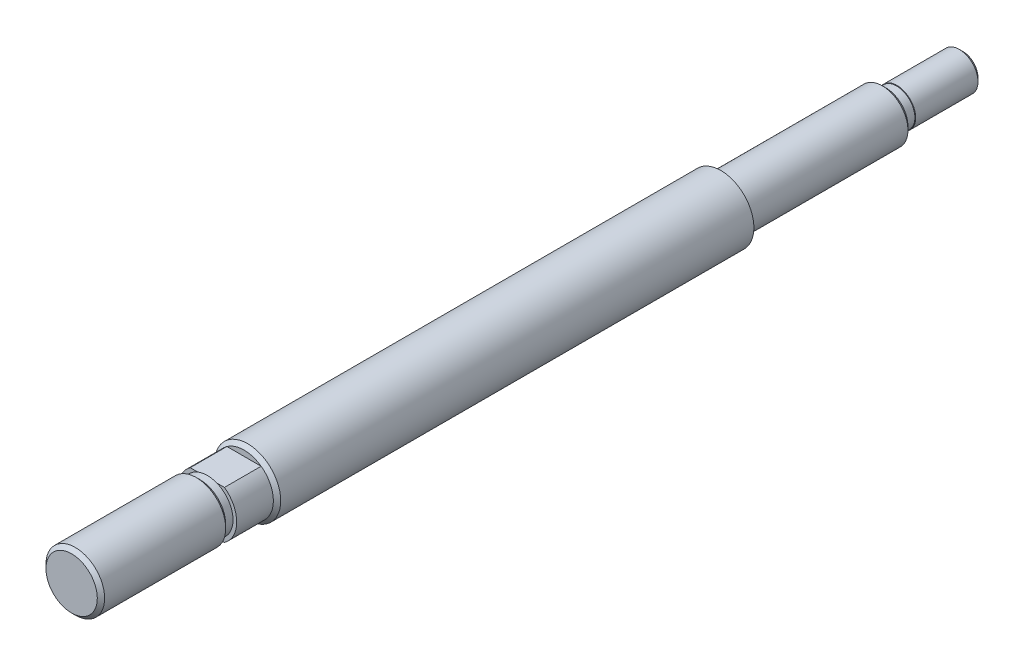
ISO-10303-21;
HEADER;
FILE_DESCRIPTION(('STEP AP214'),'2;1');
FILE_NAME('part.step','',(''),(''),'','','');
FILE_SCHEMA(('AUTOMOTIVE_DESIGN { 1 0 10303 214 1 1 1 1 }'));
ENDSEC;
DATA;
#1=APPLICATION_CONTEXT('core data for automotive mechanical design processes');
#2=APPLICATION_PROTOCOL_DEFINITION('international standard','automotive_design',2000,#1);
#3=PRODUCT_CONTEXT('',#1,'mechanical');
#4=PRODUCT('Part','Part','',(#3));
#5=PRODUCT_RELATED_PRODUCT_CATEGORY('part','',(#4));
#6=PRODUCT_DEFINITION_FORMATION('','',#4);
#7=PRODUCT_DEFINITION_CONTEXT('part definition',#1,'design');
#8=PRODUCT_DEFINITION('design','',#6,#7);
#9=PRODUCT_DEFINITION_SHAPE('','',#8);
#10=(LENGTH_UNIT() NAMED_UNIT(*) SI_UNIT(.MILLI.,.METRE.));
#11=(NAMED_UNIT(*) PLANE_ANGLE_UNIT() SI_UNIT($,.RADIAN.));
#12=(NAMED_UNIT(*) SI_UNIT($,.STERADIAN.) SOLID_ANGLE_UNIT());
#13=UNCERTAINTY_MEASURE_WITH_UNIT(LENGTH_MEASURE(1.E-05),#10,'distance_accuracy_value','');
#14=(GEOMETRIC_REPRESENTATION_CONTEXT(3) GLOBAL_UNCERTAINTY_ASSIGNED_CONTEXT((#13)) GLOBAL_UNIT_ASSIGNED_CONTEXT((#10,
#11,#12)) REPRESENTATION_CONTEXT('',''));
#15=CARTESIAN_POINT('',(0.,0.,0.));
#16=DIRECTION('',(0.,0.,1.));
#17=DIRECTION('',(1.,0.,0.));
#18=AXIS2_PLACEMENT_3D('',#15,#16,#17);
#19=CARTESIAN_POINT('',(0.,0.,84.5));
#20=DIRECTION('',(0.,0.,1.));
#21=DIRECTION('',(1.,0.,0.));
#22=AXIS2_PLACEMENT_3D('',#19,#20,#21);
#23=PLANE('',#22);
#24=DIRECTION('',(1.,0.,0.));
#25=VECTOR('',#24,1.);
#26=CARTESIAN_POINT('',(-17.5,-6.5,84.5));
#27=LINE('',#26,#25);
#28=CARTESIAN_POINT('',(2.59807621135341,-6.5,84.4999999999914));
#29=VERTEX_POINT('',#28);
#30=CARTESIAN_POINT('',(4.66368952654441,-6.5,84.5));
#31=VERTEX_POINT('',#30);
#32=EDGE_CURVE('E113',#29,#31,#27,.T.);
#33=ORIENTED_EDGE('',*,*,#32,.T.);
#34=CARTESIAN_POINT('',(0.,0.,84.5));
#35=DIRECTION('',(0.,0.,1.));
#36=DIRECTION('',(1.,0.,0.));
#37=AXIS2_PLACEMENT_3D('',#34,#35,#36);
#38=CIRCLE('',#37,8.);
#39=CARTESIAN_POINT('',(4.66368952654441,6.5,84.5));
#40=VERTEX_POINT('',#39);
#41=EDGE_CURVE('E126',#31,#40,#38,.T.);
#42=ORIENTED_EDGE('',*,*,#41,.T.);
#43=DIRECTION('',(1.,0.,0.));
#44=VECTOR('',#43,1.);
#45=CARTESIAN_POINT('',(-17.5,6.5,84.5));
#46=LINE('',#45,#44);
#47=CARTESIAN_POINT('',(2.59807621135341,6.5,84.4999999999914));
#48=VERTEX_POINT('',#47);
#49=EDGE_CURVE('E267',#48,#40,#46,.T.);
#50=ORIENTED_EDGE('',*,*,#49,.F.);
#51=CARTESIAN_POINT('',(0.,0.,84.4999999999914));
#52=DIRECTION('',(0.,0.,1.));
#53=DIRECTION('',(1.,0.,0.));
#54=AXIS2_PLACEMENT_3D('',#51,#52,#53);
#55=CIRCLE('',#54,7.00000000000003);
#56=EDGE_CURVE('E263',#29,#48,#55,.T.);
#57=ORIENTED_EDGE('',*,*,#56,.F.);
#58=EDGE_LOOP('',(#33,#42,#50,#57));
#59=FACE_BOUND('',#58,.T.);
#60=ADVANCED_FACE('F49',(#59),#23,.T.);
#61=CARTESIAN_POINT('',(0.,0.,84.5));
#62=DIRECTION('',(0.,0.,-1.));
#63=DIRECTION('',(-1.,0.,0.));
#64=AXIS2_PLACEMENT_3D('',#61,#62,#63);
#65=CYLINDRICAL_SURFACE('',#64,8.);
#66=CARTESIAN_POINT('',(0.,0.,74.5));
#67=DIRECTION('',(0.,0.,1.));
#68=DIRECTION('',(1.,0.,0.));
#69=AXIS2_PLACEMENT_3D('',#66,#67,#68);
#70=CIRCLE('',#69,8.);
#71=CARTESIAN_POINT('',(-4.66368952654447,6.5,74.5));
#72=VERTEX_POINT('',#71);
#73=CARTESIAN_POINT('',(-4.66368952654447,-6.5,74.5));
#74=VERTEX_POINT('',#73);
#75=EDGE_CURVE('E121',#72,#74,#70,.T.);
#76=ORIENTED_EDGE('',*,*,#75,.T.);
#77=DIRECTION('',(0.,0.,-1.));
#78=VECTOR('',#77,1.);
#79=CARTESIAN_POINT('',(-4.66368952654441,-6.5,84.5));
#80=LINE('',#79,#78);
#81=CARTESIAN_POINT('',(-4.66368952654441,-6.5,84.5));
#82=VERTEX_POINT('',#81);
#83=EDGE_CURVE('E106',#74,#82,#80,.F.);
#84=ORIENTED_EDGE('',*,*,#83,.T.);
#85=CARTESIAN_POINT('',(-4.66368952654441,6.5,84.5));
#86=VERTEX_POINT('',#85);
#87=EDGE_CURVE('E119',#86,#82,#38,.T.);
#88=ORIENTED_EDGE('',*,*,#87,.F.);
#89=DIRECTION('',(0.,0.,-1.));
#90=VECTOR('',#89,1.);
#91=CARTESIAN_POINT('',(-4.66368952654441,6.5,84.5));
#92=LINE('',#91,#90);
#93=EDGE_CURVE('E258',#86,#72,#92,.T.);
#94=ORIENTED_EDGE('',*,*,#93,.T.);
#95=EDGE_LOOP('',(#76,#84,#88,#94));
#96=FACE_BOUND('',#95,.T.);
#97=ADVANCED_FACE('F117',(#96),#65,.T.);
#98=CARTESIAN_POINT('',(-2.59807621135341,-6.5,84.4999999999914));
#99=VERTEX_POINT('',#98);
#100=EDGE_CURVE('E102',#82,#99,#27,.T.);
#101=ORIENTED_EDGE('',*,*,#100,.T.);
#102=CARTESIAN_POINT('',(-2.59807621135341,6.5,84.4999999999914));
#103=VERTEX_POINT('',#102);
#104=EDGE_CURVE('E279',#103,#99,#55,.T.);
#105=ORIENTED_EDGE('',*,*,#104,.F.);
#106=EDGE_CURVE('E71',#86,#103,#46,.T.);
#107=ORIENTED_EDGE('',*,*,#106,.F.);
#108=ORIENTED_EDGE('',*,*,#87,.T.);
#109=EDGE_LOOP('',(#101,#105,#107,#108));
#110=FACE_BOUND('',#109,.T.);
#111=ADVANCED_FACE('F124',(#110),#23,.T.);
#112=CARTESIAN_POINT('',(0.,0.,121.5));
#113=DIRECTION('',(0.,0.,-1.));
#114=DIRECTION('',(-1.,0.,0.));
#115=AXIS2_PLACEMENT_3D('',#112,#113,#114);
#116=CYLINDRICAL_SURFACE('',#115,9.);
#117=CARTESIAN_POINT('',(0.,0.,73.5));
#118=DIRECTION('',(0.,0.,1.));
#119=DIRECTION('',(1.,0.,0.));
#120=AXIS2_PLACEMENT_3D('',#117,#118,#119);
#121=CIRCLE('',#120,9.);
#122=CARTESIAN_POINT('',(9.,0.,73.5));
#123=VERTEX_POINT('',#122);
#124=EDGE_CURVE('E161',#123,#123,#121,.F.);
#125=ORIENTED_EDGE('',*,*,#124,.T.);
#126=EDGE_LOOP('',(#125));
#127=FACE_BOUND('',#126,.T.);
#128=CARTESIAN_POINT('',(0.,0.,-55.5));
#129=DIRECTION('',(0.,0.,-1.));
#130=DIRECTION('',(-1.,0.,0.));
#131=AXIS2_PLACEMENT_3D('',#128,#129,#130);
#132=CIRCLE('',#131,9.);
#133=CARTESIAN_POINT('',(-9.,0.,-55.5));
#134=VERTEX_POINT('',#133);
#135=EDGE_CURVE('E129',#134,#134,#132,.T.);
#136=ORIENTED_EDGE('',*,*,#135,.F.);
#137=EDGE_LOOP('',(#136));
#138=FACE_BOUND('',#137,.T.);
#139=ADVANCED_FACE('F212',(#127,#138),#116,.T.);
#140=CARTESIAN_POINT('',(0.,0.,-100.5));
#141=DIRECTION('',(0.,0.,-1.));
#142=DIRECTION('',(-1.,0.,0.));
#143=AXIS2_PLACEMENT_3D('',#140,#141,#142);
#144=PLANE('',#143);
#145=CARTESIAN_POINT('',(0.,0.,-100.5));
#146=DIRECTION('',(0.,0.,-1.));
#147=DIRECTION('',(-1.,0.,0.));
#148=AXIS2_PLACEMENT_3D('',#145,#146,#147);
#149=CIRCLE('',#148,6.00000000000012);
#150=CARTESIAN_POINT('',(-6.00000000000012,0.,-100.5));
#151=VERTEX_POINT('',#150);
#152=EDGE_CURVE('E141',#151,#151,#149,.T.);
#153=ORIENTED_EDGE('',*,*,#152,.T.);
#154=EDGE_LOOP('',(#153));
#155=FACE_BOUND('',#154,.T.);
#156=CARTESIAN_POINT('',(0.,0.,-100.5));
#157=DIRECTION('',(0.,0.,-1.));
#158=DIRECTION('',(-1.,0.,0.));
#159=AXIS2_PLACEMENT_3D('',#156,#157,#158);
#160=CIRCLE('',#159,5.);
#161=CARTESIAN_POINT('',(-5.,0.,-100.5));
#162=VERTEX_POINT('',#161);
#163=EDGE_CURVE('E138',#162,#162,#160,.T.);
#164=ORIENTED_EDGE('',*,*,#163,.F.);
#165=EDGE_LOOP('',(#164));
#166=FACE_BOUND('',#165,.T.);
#167=ADVANCED_FACE('F217',(#155,#166),#144,.T.);
#168=CARTESIAN_POINT('',(0.,0.,-100.5));
#169=DIRECTION('',(0.,0.,-1.));
#170=DIRECTION('',(-1.,0.,0.));
#171=AXIS2_PLACEMENT_3D('',#168,#169,#170);
#172=CYLINDRICAL_SURFACE('',#171,5.);
#173=CARTESIAN_POINT('',(0.,0.,-103.4));
#174=DIRECTION('',(0.,0.,-1.));
#175=DIRECTION('',(-1.,0.,0.));
#176=AXIS2_PLACEMENT_3D('',#173,#174,#175);
#177=CIRCLE('',#176,5.);
#178=CARTESIAN_POINT('',(-5.,0.,-103.4));
#179=VERTEX_POINT('',#178);
#180=EDGE_CURVE('E158',#179,#179,#177,.F.);
#181=ORIENTED_EDGE('',*,*,#180,.T.);
#182=EDGE_LOOP('',(#181));
#183=FACE_BOUND('',#182,.T.);
#184=ORIENTED_EDGE('',*,*,#163,.T.);
#185=EDGE_LOOP('',(#184));
#186=FACE_BOUND('',#185,.T.);
#187=ADVANCED_FACE('F224',(#183,#186),#172,.T.);
#188=CARTESIAN_POINT('',(0.,0.,-121.5));
#189=DIRECTION('',(0.,0.,1.));
#190=DIRECTION('',(1.,0.,0.));
#191=AXIS2_PLACEMENT_3D('',#188,#189,#190);
#192=PLANE('',#191);
#193=CARTESIAN_POINT('',(0.,0.,-121.5));
#194=DIRECTION('',(0.,0.,1.));
#195=DIRECTION('',(1.,0.,0.));
#196=AXIS2_PLACEMENT_3D('',#193,#194,#195);
#197=CIRCLE('',#196,4.10000000000005);
#198=CARTESIAN_POINT('',(4.10000000000005,0.,-121.5));
#199=VERTEX_POINT('',#198);
#200=EDGE_CURVE('E155',#199,#199,#197,.F.);
#201=ORIENTED_EDGE('',*,*,#200,.T.);
#202=EDGE_LOOP('',(#201));
#203=FACE_BOUND('',#202,.T.);
#204=ADVANCED_FACE('F229',(#203),#192,.F.);
#205=CARTESIAN_POINT('',(0.,0.,-102.5));
#206=DIRECTION('',(0.,0.,-1.));
#207=DIRECTION('',(-1.,0.,0.));
#208=AXIS2_PLACEMENT_3D('',#205,#206,#207);
#209=CYLINDRICAL_SURFACE('',#208,5.1);
#210=CARTESIAN_POINT('',(0.,0.,-103.5));
#211=DIRECTION('',(0.,0.,-1.));
#212=DIRECTION('',(-1.,0.,0.));
#213=AXIS2_PLACEMENT_3D('',#210,#211,#212);
#214=CIRCLE('',#213,5.1);
#215=CARTESIAN_POINT('',(-5.1,0.,-103.5));
#216=VERTEX_POINT('',#215);
#217=EDGE_CURVE('E152',#216,#216,#214,.T.);
#218=ORIENTED_EDGE('',*,*,#217,.T.);
#219=EDGE_LOOP('',(#218));
#220=FACE_BOUND('',#219,.T.);
#221=CARTESIAN_POINT('',(0.,0.,-120.5));
#222=DIRECTION('',(0.,0.,1.));
#223=DIRECTION('',(1.,0.,0.));
#224=AXIS2_PLACEMENT_3D('',#221,#222,#223);
#225=CIRCLE('',#224,5.1);
#226=CARTESIAN_POINT('',(5.1,0.,-120.5));
#227=VERTEX_POINT('',#226);
#228=EDGE_CURVE('E149',#227,#227,#225,.T.);
#229=ORIENTED_EDGE('',*,*,#228,.T.);
#230=EDGE_LOOP('',(#229));
#231=FACE_BOUND('',#230,.T.);
#232=ADVANCED_FACE('F412',(#220,#231),#209,.T.);
#233=CARTESIAN_POINT('',(0.,0.,-55.5));
#234=DIRECTION('',(0.,0.,-1.));
#235=DIRECTION('',(-1.,0.,0.));
#236=AXIS2_PLACEMENT_3D('',#233,#234,#235);
#237=PLANE('',#236);
#238=CARTESIAN_POINT('',(0.,0.,-55.5));
#239=DIRECTION('',(0.,0.,-1.));
#240=DIRECTION('',(-1.,0.,0.));
#241=AXIS2_PLACEMENT_3D('',#238,#239,#240);
#242=CIRCLE('',#241,7.);
#243=CARTESIAN_POINT('',(-7.,0.,-55.5));
#244=VERTEX_POINT('',#243);
#245=EDGE_CURVE('E125',#244,#244,#242,.T.);
#246=ORIENTED_EDGE('',*,*,#245,.F.);
#247=EDGE_LOOP('',(#246));
#248=FACE_BOUND('',#247,.T.);
#249=ORIENTED_EDGE('',*,*,#135,.T.);
#250=EDGE_LOOP('',(#249));
#251=FACE_BOUND('',#250,.T.);
#252=ADVANCED_FACE('F403',(#248,#251),#237,.T.);
#253=CARTESIAN_POINT('',(0.,0.,-55.5));
#254=DIRECTION('',(0.,0.,-1.));
#255=DIRECTION('',(-1.,0.,0.));
#256=AXIS2_PLACEMENT_3D('',#253,#254,#255);
#257=CYLINDRICAL_SURFACE('',#256,7.);
#258=CARTESIAN_POINT('',(0.,0.,-99.5000000000001));
#259=DIRECTION('',(0.,0.,-1.));
#260=DIRECTION('',(-1.,0.,0.));
#261=AXIS2_PLACEMENT_3D('',#258,#259,#260);
#262=CIRCLE('',#261,7.);
#263=CARTESIAN_POINT('',(-7.,0.,-99.5000000000001));
#264=VERTEX_POINT('',#263);
#265=EDGE_CURVE('E146',#264,#264,#262,.F.);
#266=CARTESIAN_POINT('',(-7.,0.,-99.5000000000001));
#267=CARTESIAN_POINT('',(-7.,0.,-99.0416666666668));
#268=CARTESIAN_POINT('',(-7.,0.,-98.5833333333334));
#269=CARTESIAN_POINT('',(-7.,0.,-97.6666666666668));
#270=CARTESIAN_POINT('',(-7.,0.,-97.2083333333334));
#271=CARTESIAN_POINT('',(-7.,0.,-96.2916666666667));
#272=CARTESIAN_POINT('',(-7.,0.,-95.8333333333334));
#273=CARTESIAN_POINT('',(-7.,0.,-94.9166666666667));
#274=CARTESIAN_POINT('',(-7.,0.,-94.4583333333334));
#275=CARTESIAN_POINT('',(-7.,0.,-93.5416666666667));
#276=CARTESIAN_POINT('',(-7.,0.,-93.0833333333334));
#277=CARTESIAN_POINT('',(-7.,0.,-92.1666666666667));
#278=CARTESIAN_POINT('',(-7.,0.,-91.7083333333334));
#279=CARTESIAN_POINT('',(-7.,0.,-90.7916666666667));
#280=CARTESIAN_POINT('',(-7.,0.,-90.3333333333334));
#281=CARTESIAN_POINT('',(-7.,0.,-89.4166666666667));
#282=CARTESIAN_POINT('',(-7.,0.,-88.9583333333334));
#283=CARTESIAN_POINT('',(-7.,0.,-88.0416666666667));
#284=CARTESIAN_POINT('',(-7.,0.,-87.5833333333334));
#285=CARTESIAN_POINT('',(-7.,0.,-86.6666666666667));
#286=CARTESIAN_POINT('',(-7.,0.,-86.2083333333334));
#287=CARTESIAN_POINT('',(-7.,0.,-85.2916666666667));
#288=CARTESIAN_POINT('',(-7.,0.,-84.8333333333334));
#289=CARTESIAN_POINT('',(-7.,0.,-83.9166666666667));
#290=CARTESIAN_POINT('',(-7.,0.,-83.4583333333334));
#291=CARTESIAN_POINT('',(-7.,0.,-82.5416666666667));
#292=CARTESIAN_POINT('',(-7.,0.,-82.0833333333334));
#293=CARTESIAN_POINT('',(-7.,0.,-81.1666666666667));
#294=CARTESIAN_POINT('',(-7.,0.,-80.7083333333334));
#295=CARTESIAN_POINT('',(-7.,0.,-79.7916666666667));
#296=CARTESIAN_POINT('',(-7.,0.,-79.3333333333334));
#297=CARTESIAN_POINT('',(-7.,0.,-78.4166666666667));
#298=CARTESIAN_POINT('',(-7.,0.,-77.9583333333334));
#299=CARTESIAN_POINT('',(-7.,0.,-77.0416666666667));
#300=CARTESIAN_POINT('',(-7.,0.,-76.5833333333334));
#301=CARTESIAN_POINT('',(-7.,0.,-75.6666666666667));
#302=CARTESIAN_POINT('',(-7.,0.,-75.2083333333334));
#303=CARTESIAN_POINT('',(-7.,0.,-74.2916666666667));
#304=CARTESIAN_POINT('',(-7.,0.,-73.8333333333334));
#305=CARTESIAN_POINT('',(-7.,0.,-72.9166666666667));
#306=CARTESIAN_POINT('',(-7.,0.,-72.4583333333334));
#307=CARTESIAN_POINT('',(-7.,0.,-71.5416666666667));
#308=CARTESIAN_POINT('',(-7.,0.,-71.0833333333334));
#309=CARTESIAN_POINT('',(-7.,0.,-70.1666666666667));
#310=CARTESIAN_POINT('',(-7.,0.,-69.7083333333334));
#311=CARTESIAN_POINT('',(-7.,0.,-68.7916666666667));
#312=CARTESIAN_POINT('',(-7.,0.,-68.3333333333334));
#313=CARTESIAN_POINT('',(-7.,0.,-67.4166666666667));
#314=CARTESIAN_POINT('',(-7.,0.,-66.9583333333334));
#315=CARTESIAN_POINT('',(-7.,0.,-66.0416666666667));
#316=CARTESIAN_POINT('',(-7.,0.,-65.5833333333333));
#317=CARTESIAN_POINT('',(-7.,0.,-64.6666666666667));
#318=CARTESIAN_POINT('',(-7.,0.,-64.2083333333333));
#319=CARTESIAN_POINT('',(-7.,0.,-63.2916666666667));
#320=CARTESIAN_POINT('',(-7.,0.,-62.8333333333333));
#321=CARTESIAN_POINT('',(-7.,0.,-61.9166666666667));
#322=CARTESIAN_POINT('',(-7.,0.,-61.4583333333333));
#323=CARTESIAN_POINT('',(-7.,0.,-60.5416666666667));
#324=CARTESIAN_POINT('',(-7.,0.,-60.0833333333333));
#325=CARTESIAN_POINT('',(-7.,0.,-59.1666666666667));
#326=CARTESIAN_POINT('',(-7.,0.,-58.7083333333333));
#327=CARTESIAN_POINT('',(-7.,0.,-57.7916666666667));
#328=CARTESIAN_POINT('',(-7.,0.,-57.3333333333333));
#329=CARTESIAN_POINT('',(-7.,0.,-56.4166666666667));
#330=CARTESIAN_POINT('',(-7.,0.,-55.9583333333333));
#331=CARTESIAN_POINT('',(-7.,0.,-55.5));
#332=B_SPLINE_CURVE_WITH_KNOTS('',3,(#266,#267,#268,#269,#270,#271,#272,#273,#274,#275,#276,
#277,#278,#279,#280,#281,#282,#283,#284,#285,#286,#287,#288,#289,#290,#291,#292,#293,#294,#295,
#296,#297,#298,#299,#300,#301,#302,#303,#304,#305,#306,#307,#308,#309,#310,#311,#312,#313,#314,
#315,#316,#317,#318,#319,#320,#321,#322,#323,#324,#325,#326,#327,#328,#329,#330,#331),
.UNSPECIFIED.,.F.,.F.,(4,2,2,2,2,2,2,2,2,2,2,2,2,2,2,2,2,2,2,2,2,2,2,2,2,2,2,2,2,2,2,2,4),(0.,
1.37499999999999,2.75,4.125,5.50000000000001,6.87500000000002,8.25000000000001,9.62500000000002,
11.,12.375,13.75,15.125,16.5,17.875,19.25,20.625,22.,23.375,24.75,26.1250000000001,
27.5000000000001,28.8750000000001,30.2500000000001,31.6250000000001,33.0000000000001,
34.3750000000001,35.7500000000001,37.1250000000001,38.5000000000001,39.8750000000001,
41.2500000000001,42.6250000000001,44.0000000000001),.UNSPECIFIED.);
#333=EDGE_CURVE('BSEAM234',#264,#244,#332,.T.);
#334=ORIENTED_EDGE('',*,*,#265,.T.);
#335=ORIENTED_EDGE('',*,*,#245,.T.);
#336=ORIENTED_EDGE('',*,*,#333,.T.);
#337=ORIENTED_EDGE('',*,*,#333,.F.);
#338=EDGE_LOOP('',(#334,#336,#335,#337));
#339=FACE_BOUND('',#338,.T.);
#340=ADVANCED_FACE('F234',(#339),#257,.T.);
#341=CARTESIAN_POINT('',(0.,0.,-100.5));
#342=DIRECTION('',(0.,0.,1.));
#343=DIRECTION('',(1.,0.,0.));
#344=AXIS2_PLACEMENT_3D('',#341,#342,#343);
#345=CONICAL_SURFACE('',#344,6.00000000000012,0.785398163397446);
#346=ORIENTED_EDGE('',*,*,#265,.F.);
#347=EDGE_LOOP('',(#346));
#348=FACE_BOUND('',#347,.T.);
#349=ORIENTED_EDGE('',*,*,#152,.F.);
#350=EDGE_LOOP('',(#349));
#351=FACE_BOUND('',#350,.T.);
#352=ADVANCED_FACE('F230',(#348,#351),#345,.T.);
#353=CARTESIAN_POINT('',(0.,0.,-102.5));
#354=DIRECTION('',(0.,0.,-1.));
#355=DIRECTION('',(-1.,0.,0.));
#356=AXIS2_PLACEMENT_3D('',#353,#354,#355);
#357=CONICAL_SURFACE('',#356,4.09999999999998,0.785398163397457);
#358=ORIENTED_EDGE('',*,*,#217,.F.);
#359=EDGE_LOOP('',(#358));
#360=FACE_BOUND('',#359,.T.);
#361=ORIENTED_EDGE('',*,*,#180,.F.);
#362=EDGE_LOOP('',(#361));
#363=FACE_BOUND('',#362,.T.);
#364=ADVANCED_FACE('F233',(#360,#363),#357,.T.);
#365=CARTESIAN_POINT('',(0.,0.,-121.5));
#366=DIRECTION('',(0.,0.,1.));
#367=DIRECTION('',(1.,0.,0.));
#368=AXIS2_PLACEMENT_3D('',#365,#366,#367);
#369=CONICAL_SURFACE('',#368,4.10000000000005,0.785398163397438);
#370=ORIENTED_EDGE('',*,*,#228,.F.);
#371=EDGE_LOOP('',(#370));
#372=FACE_BOUND('',#371,.T.);
#373=ORIENTED_EDGE('',*,*,#200,.F.);
#374=EDGE_LOOP('',(#373));
#375=FACE_BOUND('',#374,.T.);
#376=ADVANCED_FACE('F238',(#372,#375),#369,.T.);
#377=ORIENTED_EDGE('',*,*,#41,.F.);
#378=DIRECTION('',(0.,0.,-1.));
#379=VECTOR('',#378,1.);
#380=CARTESIAN_POINT('',(4.66368952654441,-6.5,84.5));
#381=LINE('',#380,#379);
#382=CARTESIAN_POINT('',(4.66368952654447,-6.5,74.5));
#383=VERTEX_POINT('',#382);
#384=EDGE_CURVE('E122',#31,#383,#381,.T.);
#385=ORIENTED_EDGE('',*,*,#384,.T.);
#386=CARTESIAN_POINT('',(4.66368952654447,6.5,74.5));
#387=VERTEX_POINT('',#386);
#388=EDGE_CURVE('E136',#383,#387,#70,.T.);
#389=ORIENTED_EDGE('',*,*,#388,.T.);
#390=DIRECTION('',(0.,0.,-1.));
#391=VECTOR('',#390,1.);
#392=CARTESIAN_POINT('',(4.66368952654441,6.5,84.5));
#393=LINE('',#392,#391);
#394=EDGE_CURVE('E261',#387,#40,#393,.F.);
#395=ORIENTED_EDGE('',*,*,#394,.T.);
#396=EDGE_LOOP('',(#377,#385,#389,#395));
#397=FACE_BOUND('',#396,.T.);
#398=ADVANCED_FACE('F209',(#397),#65,.T.);
#399=CARTESIAN_POINT('',(0.,0.,74.5));
#400=DIRECTION('',(0.,0.,-1.));
#401=DIRECTION('',(-1.,0.,0.));
#402=AXIS2_PLACEMENT_3D('',#399,#400,#401);
#403=CONICAL_SURFACE('',#402,8.00000000000004,0.785398163397436);
#404=ORIENTED_EDGE('',*,*,#124,.F.);
#405=EDGE_LOOP('',(#404));
#406=FACE_BOUND('',#405,.T.);
#407=EDGE_CURVE('E131',#387,#72,#70,.T.);
#408=ORIENTED_EDGE('',*,*,#407,.F.);
#409=ORIENTED_EDGE('',*,*,#388,.F.);
#410=EDGE_CURVE('E277',#74,#383,#70,.T.);
#411=ORIENTED_EDGE('',*,*,#410,.F.);
#412=ORIENTED_EDGE('',*,*,#75,.F.);
#413=EDGE_LOOP('',(#408,#409,#411,#412));
#414=FACE_BOUND('',#413,.T.);
#415=ADVANCED_FACE('F197',(#406,#414),#403,.T.);
#416=CARTESIAN_POINT('',(0.,0.,-500000.));
#417=DIRECTION('',(0.,0.,1.));
#418=DIRECTION('',(1.,0.,0.));
#419=AXIS2_PLACEMENT_3D('',#416,#417,#418);
#420=CYLINDRICAL_SURFACE('',#419,7.00000000000003);
#421=EDGE_CURVE('E134',#48,#103,#55,.T.);
#422=ORIENTED_EDGE('',*,*,#421,.T.);
#423=ORIENTED_EDGE('',*,*,#104,.T.);
#424=EDGE_CURVE('E264',#99,#29,#55,.T.);
#425=ORIENTED_EDGE('',*,*,#424,.T.);
#426=ORIENTED_EDGE('',*,*,#56,.T.);
#427=EDGE_LOOP('',(#422,#423,#425,#426));
#428=FACE_BOUND('',#427,.T.);
#429=CARTESIAN_POINT('',(0.,0.,86.5));
#430=DIRECTION('',(0.,0.,1.));
#431=DIRECTION('',(1.,0.,0.));
#432=AXIS2_PLACEMENT_3D('',#429,#430,#431);
#433=CIRCLE('',#432,7.00000000000003);
#434=CARTESIAN_POINT('',(7.00000000000003,0.,86.5));
#435=VERTEX_POINT('',#434);
#436=EDGE_CURVE('E57',#435,#435,#433,.F.);
#437=ORIENTED_EDGE('',*,*,#436,.T.);
#438=EDGE_LOOP('',(#437));
#439=FACE_BOUND('',#438,.T.);
#440=ADVANCED_FACE('F172',(#428,#439),#420,.T.);
#441=CARTESIAN_POINT('',(0.,0.,121.5));
#442=DIRECTION('',(0.,0.,1.));
#443=DIRECTION('',(1.,0.,0.));
#444=AXIS2_PLACEMENT_3D('',#441,#442,#443);
#445=PLANE('',#444);
#446=CARTESIAN_POINT('',(0.,0.,121.5));
#447=DIRECTION('',(0.,0.,1.));
#448=DIRECTION('',(1.,0.,0.));
#449=AXIS2_PLACEMENT_3D('',#446,#447,#448);
#450=CIRCLE('',#449,7.00000000000001);
#451=CARTESIAN_POINT('',(7.00000000000001,0.,121.5));
#452=VERTEX_POINT('',#451);
#453=EDGE_CURVE('E12',#452,#452,#450,.T.);
#454=ORIENTED_EDGE('',*,*,#453,.T.);
#455=EDGE_LOOP('',(#454));
#456=FACE_BOUND('',#455,.T.);
#457=ADVANCED_FACE('F188',(#456),#445,.T.);
#458=CARTESIAN_POINT('',(0.,0.,121.5));
#459=DIRECTION('',(0.,0.,-1.));
#460=DIRECTION('',(-1.,0.,0.));
#461=AXIS2_PLACEMENT_3D('',#458,#459,#460);
#462=CONICAL_SURFACE('',#461,7.00000000000001,0.785398163397431);
#463=CARTESIAN_POINT('',(0.,0.,120.5));
#464=DIRECTION('',(0.,0.,1.));
#465=DIRECTION('',(1.,0.,0.));
#466=AXIS2_PLACEMENT_3D('',#463,#464,#465);
#467=CIRCLE('',#466,8.);
#468=CARTESIAN_POINT('',(8.,0.,120.5));
#469=VERTEX_POINT('',#468);
#470=EDGE_CURVE('E164',#469,#469,#467,.F.);
#471=ORIENTED_EDGE('',*,*,#470,.F.);
#472=EDGE_LOOP('',(#471));
#473=FACE_BOUND('',#472,.T.);
#474=ORIENTED_EDGE('',*,*,#453,.F.);
#475=EDGE_LOOP('',(#474));
#476=FACE_BOUND('',#475,.T.);
#477=ADVANCED_FACE('F51',(#473,#476),#462,.T.);
#478=CARTESIAN_POINT('',(0.,0.,86.5));
#479=DIRECTION('',(0.,0.,1.));
#480=DIRECTION('',(1.,0.,0.));
#481=AXIS2_PLACEMENT_3D('',#478,#479,#480);
#482=CYLINDRICAL_SURFACE('',#481,8.);
#483=CARTESIAN_POINT('',(0.,0.,87.5));
#484=DIRECTION('',(0.,0.,1.));
#485=DIRECTION('',(1.,0.,0.));
#486=AXIS2_PLACEMENT_3D('',#483,#484,#485);
#487=CIRCLE('',#486,8.);
#488=CARTESIAN_POINT('',(8.,0.,87.5));
#489=VERTEX_POINT('',#488);
#490=EDGE_CURVE('E167',#489,#489,#487,.T.);
#491=ORIENTED_EDGE('',*,*,#490,.T.);
#492=EDGE_LOOP('',(#491));
#493=FACE_BOUND('',#492,.T.);
#494=ORIENTED_EDGE('',*,*,#470,.T.);
#495=EDGE_LOOP('',(#494));
#496=FACE_BOUND('',#495,.T.);
#497=ADVANCED_FACE('F178',(#493,#496),#482,.T.);
#498=CARTESIAN_POINT('',(0.,0.,87.5));
#499=DIRECTION('',(0.,0.,1.));
#500=DIRECTION('',(1.,0.,0.));
#501=AXIS2_PLACEMENT_3D('',#498,#499,#500);
#502=CONICAL_SURFACE('',#501,8.,0.785398163397431);
#503=ORIENTED_EDGE('',*,*,#436,.F.);
#504=EDGE_LOOP('',(#503));
#505=FACE_BOUND('',#504,.T.);
#506=ORIENTED_EDGE('',*,*,#490,.F.);
#507=EDGE_LOOP('',(#506));
#508=FACE_BOUND('',#507,.T.);
#509=ADVANCED_FACE('F174',(#505,#508),#502,.T.);
#510=CARTESIAN_POINT('',(-17.5,6.5,84.5));
#511=DIRECTION('',(0.,-1.,0.));
#512=DIRECTION('',(0.,0.,-1.));
#513=AXIS2_PLACEMENT_3D('',#510,#511,#512);
#514=PLANE('',#513);
#515=ORIENTED_EDGE('',*,*,#106,.T.);
#516=EDGE_CURVE('E268',#103,#48,#46,.T.);
#517=ORIENTED_EDGE('',*,*,#516,.T.);
#518=ORIENTED_EDGE('',*,*,#49,.T.);
#519=ORIENTED_EDGE('',*,*,#394,.F.);
#520=DIRECTION('',(1.,0.,0.));
#521=VECTOR('',#520,1.);
#522=CARTESIAN_POINT('',(-17.5,6.5,74.5));
#523=LINE('',#522,#521);
#524=EDGE_CURVE('E256',#72,#387,#523,.T.);
#525=ORIENTED_EDGE('',*,*,#524,.F.);
#526=ORIENTED_EDGE('',*,*,#93,.F.);
#527=EDGE_LOOP('',(#515,#517,#518,#519,#525,#526));
#528=FACE_BOUND('',#527,.T.);
#529=ADVANCED_FACE('F177',(#528),#514,.F.);
#530=CARTESIAN_POINT('',(-17.5,6.5,84.5));
#531=DIRECTION('',(0.,0.,1.));
#532=DIRECTION('',(1.,0.,0.));
#533=AXIS2_PLACEMENT_3D('',#530,#531,#532);
#534=PLANE('',#533);
#535=ORIENTED_EDGE('',*,*,#516,.F.);
#536=ORIENTED_EDGE('',*,*,#421,.F.);
#537=EDGE_LOOP('',(#535,#536));
#538=FACE_BOUND('',#537,.T.);
#539=ADVANCED_FACE('F295',(#538),#534,.F.);
#540=CARTESIAN_POINT('',(-17.5,8.00000000000004,74.5));
#541=DIRECTION('',(0.,0.,-1.));
#542=DIRECTION('',(-1.,0.,0.));
#543=AXIS2_PLACEMENT_3D('',#540,#541,#542);
#544=PLANE('',#543);
#545=ORIENTED_EDGE('',*,*,#407,.T.);
#546=ORIENTED_EDGE('',*,*,#524,.T.);
#547=EDGE_LOOP('',(#545,#546));
#548=FACE_BOUND('',#547,.T.);
#549=ADVANCED_FACE('F255',(#548),#544,.F.);
#550=CARTESIAN_POINT('',(-17.5,-6.5,84.5));
#551=DIRECTION('',(0.,1.,0.));
#552=DIRECTION('',(0.,0.,1.));
#553=AXIS2_PLACEMENT_3D('',#550,#551,#552);
#554=PLANE('',#553);
#555=ORIENTED_EDGE('',*,*,#32,.F.);
#556=EDGE_CURVE('E63',#99,#29,#27,.T.);
#557=ORIENTED_EDGE('',*,*,#556,.F.);
#558=ORIENTED_EDGE('',*,*,#100,.F.);
#559=ORIENTED_EDGE('',*,*,#83,.F.);
#560=DIRECTION('',(1.,0.,0.));
#561=VECTOR('',#560,1.);
#562=CARTESIAN_POINT('',(-17.5,-6.5,74.5));
#563=LINE('',#562,#561);
#564=EDGE_CURVE('E272',#74,#383,#563,.T.);
#565=ORIENTED_EDGE('',*,*,#564,.T.);
#566=ORIENTED_EDGE('',*,*,#384,.F.);
#567=EDGE_LOOP('',(#555,#557,#558,#559,#565,#566));
#568=FACE_BOUND('',#567,.T.);
#569=ADVANCED_FACE('F104',(#568),#554,.F.);
#570=CARTESIAN_POINT('',(-17.5,-6.5,84.5));
#571=DIRECTION('',(0.,0.,1.));
#572=DIRECTION('',(1.,0.,0.));
#573=AXIS2_PLACEMENT_3D('',#570,#571,#572);
#574=PLANE('',#573);
#575=ORIENTED_EDGE('',*,*,#556,.T.);
#576=ORIENTED_EDGE('',*,*,#424,.F.);
#577=EDGE_LOOP('',(#575,#576));
#578=FACE_BOUND('',#577,.T.);
#579=ADVANCED_FACE('F281',(#578),#574,.F.);
#580=CARTESIAN_POINT('',(-17.5,-8.00000000000004,74.5));
#581=DIRECTION('',(0.,0.,-1.));
#582=DIRECTION('',(-1.,0.,0.));
#583=AXIS2_PLACEMENT_3D('',#580,#581,#582);
#584=PLANE('',#583);
#585=ORIENTED_EDGE('',*,*,#410,.T.);
#586=ORIENTED_EDGE('',*,*,#564,.F.);
#587=EDGE_LOOP('',(#585,#586));
#588=FACE_BOUND('',#587,.T.);
#589=ADVANCED_FACE('F283',(#588),#584,.F.);
#590=CLOSED_SHELL('',(#60,#97,#111,#139,#167,#187,#204,#232,#252,#340,#352,#364,#376,#398,#415,
#440,#457,#477,#497,#509,#529,#539,#549,#569,#579,#589));
#591=MANIFOLD_SOLID_BREP('B2',#590);
#592=ADVANCED_BREP_SHAPE_REPRESENTATION('',(#18,#591),#14);
#593=SHAPE_DEFINITION_REPRESENTATION(#9,#592);
ENDSEC;
END-ISO-10303-21;
